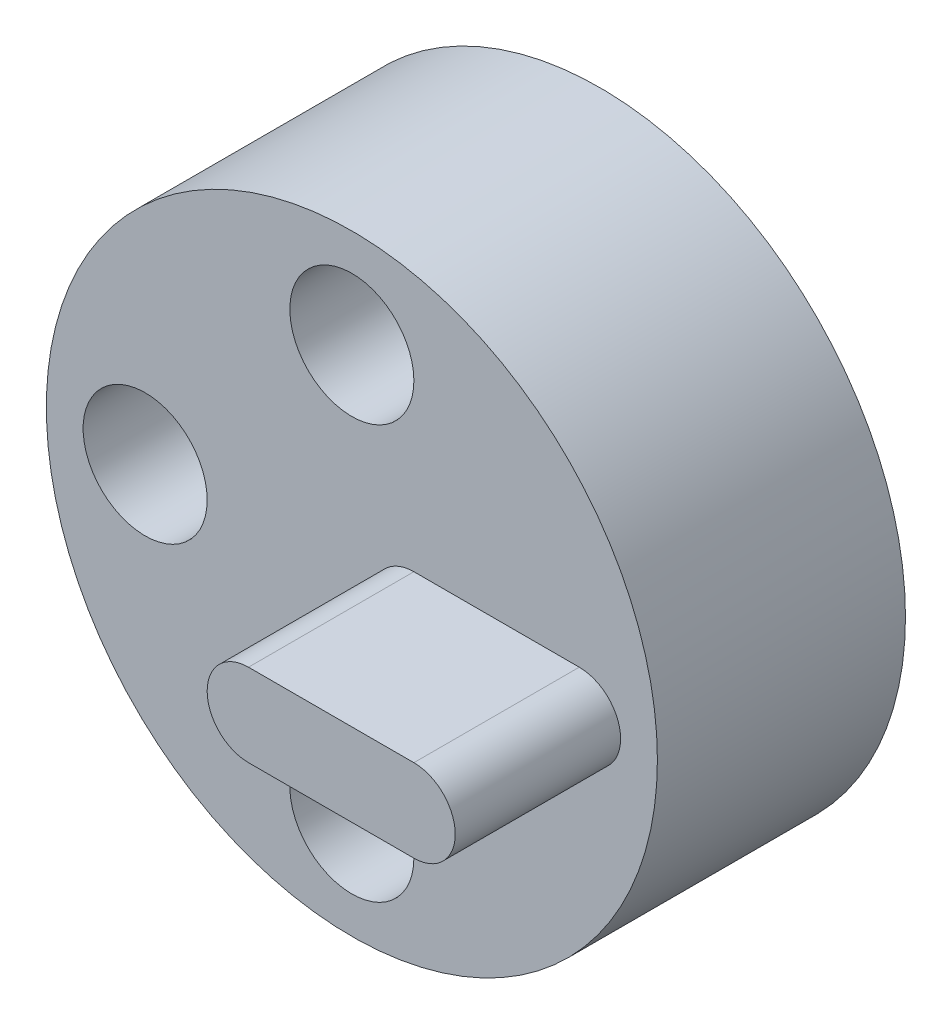
ISO-10303-21;
HEADER;
FILE_DESCRIPTION(('STEP AP214'),'2;1');
FILE_NAME('part.step','',(''),(''),'','','');
FILE_SCHEMA(('AUTOMOTIVE_DESIGN { 1 0 10303 214 1 1 1 1 }'));
ENDSEC;
DATA;
#1=APPLICATION_CONTEXT('core data for automotive mechanical design processes');
#2=APPLICATION_PROTOCOL_DEFINITION('international standard','automotive_design',2000,#1);
#3=PRODUCT_CONTEXT('',#1,'mechanical');
#4=PRODUCT('Part','Part','',(#3));
#5=PRODUCT_RELATED_PRODUCT_CATEGORY('part','',(#4));
#6=PRODUCT_DEFINITION_FORMATION('','',#4);
#7=PRODUCT_DEFINITION_CONTEXT('part definition',#1,'design');
#8=PRODUCT_DEFINITION('design','',#6,#7);
#9=PRODUCT_DEFINITION_SHAPE('','',#8);
#10=(LENGTH_UNIT() NAMED_UNIT(*) SI_UNIT(.MILLI.,.METRE.));
#11=(NAMED_UNIT(*) PLANE_ANGLE_UNIT() SI_UNIT($,.RADIAN.));
#12=(NAMED_UNIT(*) SI_UNIT($,.STERADIAN.) SOLID_ANGLE_UNIT());
#13=UNCERTAINTY_MEASURE_WITH_UNIT(LENGTH_MEASURE(1.E-05),#10,'distance_accuracy_value','');
#14=(GEOMETRIC_REPRESENTATION_CONTEXT(3) GLOBAL_UNCERTAINTY_ASSIGNED_CONTEXT((#13)) GLOBAL_UNIT_ASSIGNED_CONTEXT((#10,
#11,#12)) REPRESENTATION_CONTEXT('',''));
#15=CARTESIAN_POINT('',(0.,0.,0.));
#16=DIRECTION('',(0.,0.,1.));
#17=DIRECTION('',(1.,0.,0.));
#18=AXIS2_PLACEMENT_3D('',#15,#16,#17);
#19=CARTESIAN_POINT('',(0.,5.,6.));
#20=DIRECTION('',(0.,0.,-1.));
#21=DIRECTION('',(-1.,0.,0.));
#22=AXIS2_PLACEMENT_3D('',#19,#20,#21);
#23=CYLINDRICAL_SURFACE('',#22,1.5);
#24=CARTESIAN_POINT('',(0.,5.,6.));
#25=DIRECTION('',(0.,0.,1.));
#26=DIRECTION('',(1.,0.,0.));
#27=AXIS2_PLACEMENT_3D('',#24,#25,#26);
#28=CIRCLE('',#27,1.5);
#29=CARTESIAN_POINT('',(1.5,5.,6.));
#30=VERTEX_POINT('',#29);
#31=EDGE_CURVE('E135',#30,#30,#28,.T.);
#32=ORIENTED_EDGE('',*,*,#31,.T.);
#33=EDGE_LOOP('',(#32));
#34=FACE_BOUND('',#33,.T.);
#35=CARTESIAN_POINT('',(0.,5.,0.));
#36=DIRECTION('',(0.,0.,1.));
#37=DIRECTION('',(1.,0.,0.));
#38=AXIS2_PLACEMENT_3D('',#35,#36,#37);
#39=CIRCLE('',#38,1.5);
#40=CARTESIAN_POINT('',(1.5,5.,0.));
#41=VERTEX_POINT('',#40);
#42=EDGE_CURVE('E150',#41,#41,#39,.T.);
#43=ORIENTED_EDGE('',*,*,#42,.F.);
#44=EDGE_LOOP('',(#43));
#45=FACE_BOUND('',#44,.T.);
#46=ADVANCED_FACE('F47',(#34,#45),#23,.F.);
#47=CARTESIAN_POINT('',(-5.,0.,6.));
#48=DIRECTION('',(0.,0.,-1.));
#49=DIRECTION('',(-1.,0.,0.));
#50=AXIS2_PLACEMENT_3D('',#47,#48,#49);
#51=CYLINDRICAL_SURFACE('',#50,1.5);
#52=CARTESIAN_POINT('',(-5.,0.,6.));
#53=DIRECTION('',(0.,0.,1.));
#54=DIRECTION('',(1.,0.,0.));
#55=AXIS2_PLACEMENT_3D('',#52,#53,#54);
#56=CIRCLE('',#55,1.5);
#57=CARTESIAN_POINT('',(-3.5,0.,6.));
#58=VERTEX_POINT('',#57);
#59=EDGE_CURVE('E131',#58,#58,#56,.T.);
#60=ORIENTED_EDGE('',*,*,#59,.T.);
#61=EDGE_LOOP('',(#60));
#62=FACE_BOUND('',#61,.T.);
#63=CARTESIAN_POINT('',(-5.,0.,0.));
#64=DIRECTION('',(0.,0.,1.));
#65=DIRECTION('',(1.,0.,0.));
#66=AXIS2_PLACEMENT_3D('',#63,#64,#65);
#67=CIRCLE('',#66,1.5);
#68=CARTESIAN_POINT('',(-3.5,0.,0.));
#69=VERTEX_POINT('',#68);
#70=EDGE_CURVE('E121',#69,#69,#67,.T.);
#71=ORIENTED_EDGE('',*,*,#70,.F.);
#72=EDGE_LOOP('',(#71));
#73=FACE_BOUND('',#72,.T.);
#74=ADVANCED_FACE('F179',(#62,#73),#51,.F.);
#75=CARTESIAN_POINT('',(0.,-5.,6.));
#76=DIRECTION('',(0.,0.,-1.));
#77=DIRECTION('',(-1.,0.,0.));
#78=AXIS2_PLACEMENT_3D('',#75,#76,#77);
#79=CYLINDRICAL_SURFACE('',#78,1.5);
#80=CARTESIAN_POINT('',(0.,-5.,6.));
#81=DIRECTION('',(0.,0.,1.));
#82=DIRECTION('',(1.,0.,0.));
#83=AXIS2_PLACEMENT_3D('',#80,#81,#82);
#84=CIRCLE('',#83,1.5);
#85=CARTESIAN_POINT('',(1.50000000000004,-5.,6.));
#86=VERTEX_POINT('',#85);
#87=EDGE_CURVE('E127',#86,#86,#84,.T.);
#88=ORIENTED_EDGE('',*,*,#87,.T.);
#89=EDGE_LOOP('',(#88));
#90=FACE_BOUND('',#89,.T.);
#91=CARTESIAN_POINT('',(0.,-5.,0.));
#92=DIRECTION('',(0.,0.,1.));
#93=DIRECTION('',(1.,0.,0.));
#94=AXIS2_PLACEMENT_3D('',#91,#92,#93);
#95=CIRCLE('',#94,1.5);
#96=CARTESIAN_POINT('',(1.50000000000004,-5.,0.));
#97=VERTEX_POINT('',#96);
#98=EDGE_CURVE('E116',#97,#97,#95,.T.);
#99=ORIENTED_EDGE('',*,*,#98,.F.);
#100=EDGE_LOOP('',(#99));
#101=FACE_BOUND('',#100,.T.);
#102=ADVANCED_FACE('F49',(#90,#101),#79,.F.);
#103=CARTESIAN_POINT('',(0.,0.,6.));
#104=DIRECTION('',(0.,0.,-1.));
#105=DIRECTION('',(-1.,0.,0.));
#106=AXIS2_PLACEMENT_3D('',#103,#104,#105);
#107=CYLINDRICAL_SURFACE('',#106,7.39);
#108=CARTESIAN_POINT('',(0.,0.,6.));
#109=DIRECTION('',(0.,0.,1.));
#110=DIRECTION('',(1.,0.,0.));
#111=AXIS2_PLACEMENT_3D('',#108,#109,#110);
#112=CIRCLE('',#111,7.39);
#113=CARTESIAN_POINT('',(7.39,0.,6.));
#114=VERTEX_POINT('',#113);
#115=EDGE_CURVE('E11',#114,#114,#112,.T.);
#116=ORIENTED_EDGE('',*,*,#115,.F.);
#117=EDGE_LOOP('',(#116));
#118=FACE_BOUND('',#117,.T.);
#119=CARTESIAN_POINT('',(0.,0.,0.));
#120=DIRECTION('',(0.,0.,1.));
#121=DIRECTION('',(1.,0.,0.));
#122=AXIS2_PLACEMENT_3D('',#119,#120,#121);
#123=CIRCLE('',#122,7.39);
#124=CARTESIAN_POINT('',(7.39,0.,0.));
#125=VERTEX_POINT('',#124);
#126=EDGE_CURVE('E51',#125,#125,#123,.T.);
#127=ORIENTED_EDGE('',*,*,#126,.T.);
#128=EDGE_LOOP('',(#127));
#129=FACE_BOUND('',#128,.T.);
#130=ADVANCED_FACE('F159',(#118,#129),#107,.T.);
#131=CARTESIAN_POINT('',(0.,0.,6.));
#132=DIRECTION('',(0.,0.,1.));
#133=DIRECTION('',(1.,0.,0.));
#134=AXIS2_PLACEMENT_3D('',#131,#132,#133);
#135=PLANE('',#134);
#136=ORIENTED_EDGE('',*,*,#87,.F.);
#137=EDGE_LOOP('',(#136));
#138=FACE_BOUND('',#137,.T.);
#139=ORIENTED_EDGE('',*,*,#59,.F.);
#140=EDGE_LOOP('',(#139));
#141=FACE_BOUND('',#140,.T.);
#142=ORIENTED_EDGE('',*,*,#31,.F.);
#143=EDGE_LOOP('',(#142));
#144=FACE_BOUND('',#143,.T.);
#145=CARTESIAN_POINT('',(1.5,0.,6.));
#146=DIRECTION('',(0.,0.,1.));
#147=DIRECTION('',(1.,0.,0.));
#148=AXIS2_PLACEMENT_3D('',#145,#146,#147);
#149=CIRCLE('',#148,1.);
#150=CARTESIAN_POINT('',(1.5,1.,6.));
#151=VERTEX_POINT('',#150);
#152=CARTESIAN_POINT('',(1.5,-1.,6.));
#153=VERTEX_POINT('',#152);
#154=EDGE_CURVE('E139',#151,#153,#149,.T.);
#155=ORIENTED_EDGE('',*,*,#154,.F.);
#156=DIRECTION('',(-1.,0.,0.));
#157=VECTOR('',#156,1.);
#158=CARTESIAN_POINT('',(0.,1.,6.));
#159=LINE('',#158,#157);
#160=CARTESIAN_POINT('',(5.5,1.,6.));
#161=VERTEX_POINT('',#160);
#162=EDGE_CURVE('E114',#161,#151,#159,.T.);
#163=ORIENTED_EDGE('',*,*,#162,.F.);
#164=CARTESIAN_POINT('',(5.5,0.,6.));
#165=DIRECTION('',(0.,0.,1.));
#166=DIRECTION('',(1.,0.,0.));
#167=AXIS2_PLACEMENT_3D('',#164,#165,#166);
#168=CIRCLE('',#167,1.);
#169=CARTESIAN_POINT('',(5.5,-1.,6.));
#170=VERTEX_POINT('',#169);
#171=EDGE_CURVE('E69',#170,#161,#168,.T.);
#172=ORIENTED_EDGE('',*,*,#171,.F.);
#173=DIRECTION('',(-1.,0.,0.));
#174=VECTOR('',#173,1.);
#175=CARTESIAN_POINT('',(0.,-1.,6.));
#176=LINE('',#175,#174);
#177=EDGE_CURVE('E57',#170,#153,#176,.T.);
#178=ORIENTED_EDGE('',*,*,#177,.T.);
#179=EDGE_LOOP('',(#155,#163,#172,#178));
#180=FACE_BOUND('',#179,.T.);
#181=ORIENTED_EDGE('',*,*,#115,.T.);
#182=EDGE_LOOP('',(#181));
#183=FACE_BOUND('',#182,.T.);
#184=ADVANCED_FACE('F163',(#138,#141,#144,#180,#183),#135,.T.);
#185=CARTESIAN_POINT('',(0.,0.,0.));
#186=DIRECTION('',(0.,0.,1.));
#187=DIRECTION('',(1.,0.,0.));
#188=AXIS2_PLACEMENT_3D('',#185,#186,#187);
#189=PLANE('',#188);
#190=CARTESIAN_POINT('',(0.,0.,0.));
#191=DIRECTION('',(0.,0.,-1.));
#192=DIRECTION('',(-1.,0.,0.));
#193=AXIS2_PLACEMENT_3D('',#190,#191,#192);
#194=CIRCLE('',#193,2.65);
#195=CARTESIAN_POINT('',(-2.65,0.,0.));
#196=VERTEX_POINT('',#195);
#197=EDGE_CURVE('E274',#196,#196,#194,.T.);
#198=ORIENTED_EDGE('',*,*,#197,.F.);
#199=EDGE_LOOP('',(#198));
#200=FACE_BOUND('',#199,.T.);
#201=ORIENTED_EDGE('',*,*,#98,.T.);
#202=EDGE_LOOP('',(#201));
#203=FACE_BOUND('',#202,.T.);
#204=ORIENTED_EDGE('',*,*,#70,.T.);
#205=EDGE_LOOP('',(#204));
#206=FACE_BOUND('',#205,.T.);
#207=ORIENTED_EDGE('',*,*,#42,.T.);
#208=EDGE_LOOP('',(#207));
#209=FACE_BOUND('',#208,.T.);
#210=ORIENTED_EDGE('',*,*,#126,.F.);
#211=EDGE_LOOP('',(#210));
#212=FACE_BOUND('',#211,.T.);
#213=ADVANCED_FACE('F161',(#200,#203,#206,#209,#212),#189,.F.);
#214=CARTESIAN_POINT('',(0.,1.,10.));
#215=DIRECTION('',(0.,-1.,0.));
#216=DIRECTION('',(1.,0.,0.));
#217=AXIS2_PLACEMENT_3D('',#214,#215,#216);
#218=PLANE('',#217);
#219=ORIENTED_EDGE('',*,*,#162,.T.);
#220=DIRECTION('',(0.,0.,-1.));
#221=VECTOR('',#220,1.);
#222=CARTESIAN_POINT('',(1.5,1.,10.));
#223=LINE('',#222,#221);
#224=CARTESIAN_POINT('',(1.5,1.,10.));
#225=VERTEX_POINT('',#224);
#226=EDGE_CURVE('E92',#225,#151,#223,.T.);
#227=ORIENTED_EDGE('',*,*,#226,.F.);
#228=DIRECTION('',(-1.,0.,0.));
#229=VECTOR('',#228,1.);
#230=CARTESIAN_POINT('',(0.,1.,10.));
#231=LINE('',#230,#229);
#232=CARTESIAN_POINT('',(5.5,1.,10.));
#233=VERTEX_POINT('',#232);
#234=EDGE_CURVE('E100',#233,#225,#231,.T.);
#235=ORIENTED_EDGE('',*,*,#234,.F.);
#236=DIRECTION('',(0.,0.,-1.));
#237=VECTOR('',#236,1.);
#238=CARTESIAN_POINT('',(5.5,1.,10.));
#239=LINE('',#238,#237);
#240=EDGE_CURVE('E213',#233,#161,#239,.T.);
#241=ORIENTED_EDGE('',*,*,#240,.T.);
#242=EDGE_LOOP('',(#219,#227,#235,#241));
#243=FACE_BOUND('',#242,.T.);
#244=ADVANCED_FACE('F113',(#243),#218,.F.);
#245=CARTESIAN_POINT('',(1.5,0.,10.));
#246=DIRECTION('',(0.,0.,-1.));
#247=DIRECTION('',(-1.,0.,0.));
#248=AXIS2_PLACEMENT_3D('',#245,#246,#247);
#249=CYLINDRICAL_SURFACE('',#248,1.);
#250=ORIENTED_EDGE('',*,*,#154,.T.);
#251=DIRECTION('',(0.,0.,-1.));
#252=VECTOR('',#251,1.);
#253=CARTESIAN_POINT('',(1.5,-1.,10.));
#254=LINE('',#253,#252);
#255=CARTESIAN_POINT('',(1.5,-1.,10.));
#256=VERTEX_POINT('',#255);
#257=EDGE_CURVE('E94',#256,#153,#254,.T.);
#258=ORIENTED_EDGE('',*,*,#257,.F.);
#259=CARTESIAN_POINT('',(1.5,0.,10.));
#260=DIRECTION('',(0.,0.,1.));
#261=DIRECTION('',(1.,0.,0.));
#262=AXIS2_PLACEMENT_3D('',#259,#260,#261);
#263=CIRCLE('',#262,1.);
#264=EDGE_CURVE('E88',#225,#256,#263,.T.);
#265=ORIENTED_EDGE('',*,*,#264,.F.);
#266=ORIENTED_EDGE('',*,*,#226,.T.);
#267=EDGE_LOOP('',(#250,#258,#265,#266));
#268=FACE_BOUND('',#267,.T.);
#269=ADVANCED_FACE('F90',(#268),#249,.T.);
#270=CARTESIAN_POINT('',(0.,-1.,10.));
#271=DIRECTION('',(0.,-1.,0.));
#272=DIRECTION('',(1.,0.,0.));
#273=AXIS2_PLACEMENT_3D('',#270,#271,#272);
#274=PLANE('',#273);
#275=ORIENTED_EDGE('',*,*,#257,.T.);
#276=ORIENTED_EDGE('',*,*,#177,.F.);
#277=DIRECTION('',(0.,0.,-1.));
#278=VECTOR('',#277,1.);
#279=CARTESIAN_POINT('',(5.5,-1.,10.));
#280=LINE('',#279,#278);
#281=CARTESIAN_POINT('',(5.5,-1.,10.));
#282=VERTEX_POINT('',#281);
#283=EDGE_CURVE('E123',#282,#170,#280,.T.);
#284=ORIENTED_EDGE('',*,*,#283,.F.);
#285=DIRECTION('',(-1.,0.,0.));
#286=VECTOR('',#285,1.);
#287=CARTESIAN_POINT('',(0.,-1.,10.));
#288=LINE('',#287,#286);
#289=EDGE_CURVE('E99',#282,#256,#288,.T.);
#290=ORIENTED_EDGE('',*,*,#289,.T.);
#291=EDGE_LOOP('',(#275,#276,#284,#290));
#292=FACE_BOUND('',#291,.T.);
#293=ADVANCED_FACE('F208',(#292),#274,.T.);
#294=CARTESIAN_POINT('',(5.5,0.,10.));
#295=DIRECTION('',(0.,0.,-1.));
#296=DIRECTION('',(-1.,0.,0.));
#297=AXIS2_PLACEMENT_3D('',#294,#295,#296);
#298=CYLINDRICAL_SURFACE('',#297,1.);
#299=ORIENTED_EDGE('',*,*,#171,.T.);
#300=ORIENTED_EDGE('',*,*,#240,.F.);
#301=CARTESIAN_POINT('',(5.5,0.,10.));
#302=DIRECTION('',(0.,0.,1.));
#303=DIRECTION('',(1.,0.,0.));
#304=AXIS2_PLACEMENT_3D('',#301,#302,#303);
#305=CIRCLE('',#304,1.);
#306=EDGE_CURVE('E105',#282,#233,#305,.T.);
#307=ORIENTED_EDGE('',*,*,#306,.F.);
#308=ORIENTED_EDGE('',*,*,#283,.T.);
#309=EDGE_LOOP('',(#299,#300,#307,#308));
#310=FACE_BOUND('',#309,.T.);
#311=ADVANCED_FACE('F219',(#310),#298,.T.);
#312=CARTESIAN_POINT('',(0.,0.,10.));
#313=DIRECTION('',(0.,0.,1.));
#314=DIRECTION('',(1.,0.,0.));
#315=AXIS2_PLACEMENT_3D('',#312,#313,#314);
#316=PLANE('',#315);
#317=ORIENTED_EDGE('',*,*,#234,.T.);
#318=ORIENTED_EDGE('',*,*,#264,.T.);
#319=ORIENTED_EDGE('',*,*,#289,.F.);
#320=ORIENTED_EDGE('',*,*,#306,.T.);
#321=EDGE_LOOP('',(#317,#318,#319,#320));
#322=FACE_BOUND('',#321,.T.);
#323=ADVANCED_FACE('F103',(#322),#316,.T.);
#324=CARTESIAN_POINT('',(0.,0.,4.3));
#325=DIRECTION('',(0.,0.,-1.));
#326=DIRECTION('',(-1.,0.,0.));
#327=AXIS2_PLACEMENT_3D('',#324,#325,#326);
#328=CYLINDRICAL_SURFACE('',#327,2.65);
#329=CARTESIAN_POINT('',(0.,0.,4.3));
#330=DIRECTION('',(0.,0.,-1.));
#331=DIRECTION('',(-1.,0.,0.));
#332=AXIS2_PLACEMENT_3D('',#329,#330,#331);
#333=CIRCLE('',#332,2.65);
#334=CARTESIAN_POINT('',(-2.65,0.,4.3));
#335=VERTEX_POINT('',#334);
#336=EDGE_CURVE('E110',#335,#335,#333,.T.);
#337=CARTESIAN_POINT('',(-2.65,0.,4.3));
#338=CARTESIAN_POINT('',(-2.65,0.,4.25520833333333));
#339=CARTESIAN_POINT('',(-2.65,0.,4.21041666666667));
#340=CARTESIAN_POINT('',(-2.65,0.,4.12083333333333));
#341=CARTESIAN_POINT('',(-2.65,0.,4.07604166666667));
#342=CARTESIAN_POINT('',(-2.65,0.,3.98645833333333));
#343=CARTESIAN_POINT('',(-2.65,0.,3.94166666666667));
#344=CARTESIAN_POINT('',(-2.65,0.,3.85208333333333));
#345=CARTESIAN_POINT('',(-2.65,0.,3.80729166666667));
#346=CARTESIAN_POINT('',(-2.65,0.,3.71770833333333));
#347=CARTESIAN_POINT('',(-2.65,0.,3.67291666666667));
#348=CARTESIAN_POINT('',(-2.65,0.,3.58333333333333));
#349=CARTESIAN_POINT('',(-2.65,0.,3.53854166666667));
#350=CARTESIAN_POINT('',(-2.65,0.,3.44895833333333));
#351=CARTESIAN_POINT('',(-2.65,0.,3.40416666666667));
#352=CARTESIAN_POINT('',(-2.65,0.,3.31458333333333));
#353=CARTESIAN_POINT('',(-2.65,0.,3.26979166666667));
#354=CARTESIAN_POINT('',(-2.65,0.,3.18020833333333));
#355=CARTESIAN_POINT('',(-2.65,0.,3.13541666666667));
#356=CARTESIAN_POINT('',(-2.65,0.,3.04583333333333));
#357=CARTESIAN_POINT('',(-2.65,0.,3.00104166666667));
#358=CARTESIAN_POINT('',(-2.65,0.,2.91145833333333));
#359=CARTESIAN_POINT('',(-2.65,0.,2.86666666666667));
#360=CARTESIAN_POINT('',(-2.65,0.,2.77708333333333));
#361=CARTESIAN_POINT('',(-2.65,0.,2.73229166666667));
#362=CARTESIAN_POINT('',(-2.65,0.,2.64270833333333));
#363=CARTESIAN_POINT('',(-2.65,0.,2.59791666666667));
#364=CARTESIAN_POINT('',(-2.65,0.,2.50833333333333));
#365=CARTESIAN_POINT('',(-2.65,0.,2.46354166666667));
#366=CARTESIAN_POINT('',(-2.65,0.,2.37395833333333));
#367=CARTESIAN_POINT('',(-2.65,0.,2.32916666666667));
#368=CARTESIAN_POINT('',(-2.65,0.,2.23958333333333));
#369=CARTESIAN_POINT('',(-2.65,0.,2.19479166666667));
#370=CARTESIAN_POINT('',(-2.65,0.,2.10520833333333));
#371=CARTESIAN_POINT('',(-2.65,0.,2.06041666666667));
#372=CARTESIAN_POINT('',(-2.65,0.,1.97083333333333));
#373=CARTESIAN_POINT('',(-2.65,0.,1.92604166666667));
#374=CARTESIAN_POINT('',(-2.65,0.,1.83645833333333));
#375=CARTESIAN_POINT('',(-2.65,0.,1.79166666666667));
#376=CARTESIAN_POINT('',(-2.65,0.,1.70208333333333));
#377=CARTESIAN_POINT('',(-2.65,0.,1.65729166666667));
#378=CARTESIAN_POINT('',(-2.65,0.,1.56770833333333));
#379=CARTESIAN_POINT('',(-2.65,0.,1.52291666666667));
#380=CARTESIAN_POINT('',(-2.65,0.,1.43333333333333));
#381=CARTESIAN_POINT('',(-2.65,0.,1.38854166666667));
#382=CARTESIAN_POINT('',(-2.65,0.,1.29895833333333));
#383=CARTESIAN_POINT('',(-2.65,0.,1.25416666666667));
#384=CARTESIAN_POINT('',(-2.65,0.,1.16458333333333));
#385=CARTESIAN_POINT('',(-2.65,0.,1.11979166666667));
#386=CARTESIAN_POINT('',(-2.65,0.,1.03020833333333));
#387=CARTESIAN_POINT('',(-2.65,0.,0.985416666666667));
#388=CARTESIAN_POINT('',(-2.65,0.,0.895833333333333));
#389=CARTESIAN_POINT('',(-2.65,0.,0.851041666666667));
#390=CARTESIAN_POINT('',(-2.65,0.,0.761458333333333));
#391=CARTESIAN_POINT('',(-2.65,0.,0.716666666666667));
#392=CARTESIAN_POINT('',(-2.65,0.,0.627083333333334));
#393=CARTESIAN_POINT('',(-2.65,0.,0.582291666666667));
#394=CARTESIAN_POINT('',(-2.65,0.,0.492708333333334));
#395=CARTESIAN_POINT('',(-2.65,0.,0.447916666666667));
#396=CARTESIAN_POINT('',(-2.65,0.,0.358333333333334));
#397=CARTESIAN_POINT('',(-2.65,0.,0.313541666666667));
#398=CARTESIAN_POINT('',(-2.65,0.,0.223958333333334));
#399=CARTESIAN_POINT('',(-2.65,0.,0.179166666666667));
#400=CARTESIAN_POINT('',(-2.65,0.,0.0895833333333342));
#401=CARTESIAN_POINT('',(-2.65,0.,0.0447916666666675));
#402=CARTESIAN_POINT('',(-2.65,0.,0.));
#403=B_SPLINE_CURVE_WITH_KNOTS('',3,(#337,#338,#339,#340,#341,#342,#343,#344,#345,#346,#347,
#348,#349,#350,#351,#352,#353,#354,#355,#356,#357,#358,#359,#360,#361,#362,#363,#364,#365,#366,
#367,#368,#369,#370,#371,#372,#373,#374,#375,#376,#377,#378,#379,#380,#381,#382,#383,#384,#385,
#386,#387,#388,#389,#390,#391,#392,#393,#394,#395,#396,#397,#398,#399,#400,#401,#402),
.UNSPECIFIED.,.F.,.F.,(4,2,2,2,2,2,2,2,2,2,2,2,2,2,2,2,2,2,2,2,2,2,2,2,2,2,2,2,2,2,2,2,4),(0.,
0.134375000000001,0.268750000000001,0.403125,0.537500000000001,0.671875000000001,
0.806250000000001,0.940625,1.075,1.209375,1.34375,1.478125,1.6125,1.746875,1.88125,2.015625,
2.15,2.284375,2.41875,2.553125,2.6875,2.821875,2.95625,3.090625,3.225,3.359375,3.49375,3.628125,
3.7625,3.896875,4.03125,4.165625,4.3),.UNSPECIFIED.);
#404=EDGE_CURVE('BSEAM225',#335,#196,#403,.T.);
#405=ORIENTED_EDGE('',*,*,#336,.F.);
#406=ORIENTED_EDGE('',*,*,#197,.T.);
#407=ORIENTED_EDGE('',*,*,#404,.T.);
#408=ORIENTED_EDGE('',*,*,#404,.F.);
#409=EDGE_LOOP('',(#405,#407,#406,#408));
#410=FACE_BOUND('',#409,.T.);
#411=ADVANCED_FACE('F225',(#410),#328,.F.);
#412=CARTESIAN_POINT('',(0.,0.,4.3));
#413=DIRECTION('',(0.,0.,-1.));
#414=DIRECTION('',(-1.,0.,0.));
#415=AXIS2_PLACEMENT_3D('',#412,#413,#414);
#416=PLANE('',#415);
#417=ORIENTED_EDGE('',*,*,#336,.T.);
#418=EDGE_LOOP('',(#417));
#419=FACE_BOUND('',#418,.T.);
#420=ADVANCED_FACE('F259',(#419),#416,.T.);
#421=CLOSED_SHELL('',(#46,#74,#102,#130,#184,#213,#244,#269,#293,#311,#323,#411,#420));
#422=MANIFOLD_SOLID_BREP('B2',#421);
#423=ADVANCED_BREP_SHAPE_REPRESENTATION('',(#18,#422),#14);
#424=SHAPE_DEFINITION_REPRESENTATION(#9,#423);
ENDSEC;
END-ISO-10303-21;
